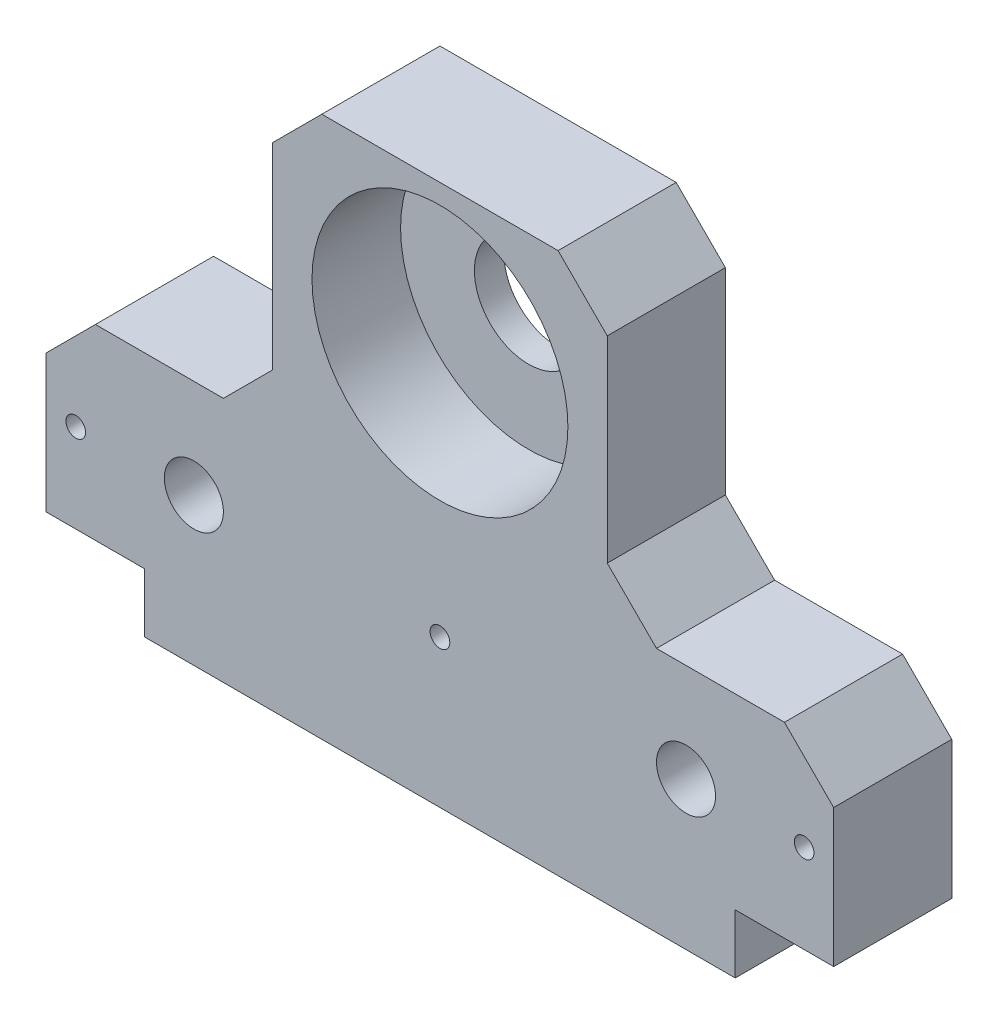
ISO-10303-21;
HEADER;
FILE_DESCRIPTION(('STEP AP214'),'2;1');
FILE_NAME('part.step','',(''),(''),'','','');
FILE_SCHEMA(('AUTOMOTIVE_DESIGN { 1 0 10303 214 1 1 1 1 }'));
ENDSEC;
DATA;
#1=APPLICATION_CONTEXT('core data for automotive mechanical design processes');
#2=APPLICATION_PROTOCOL_DEFINITION('international standard','automotive_design',2000,#1);
#3=PRODUCT_CONTEXT('',#1,'mechanical');
#4=PRODUCT('Part','Part','',(#3));
#5=PRODUCT_RELATED_PRODUCT_CATEGORY('part','',(#4));
#6=PRODUCT_DEFINITION_FORMATION('','',#4);
#7=PRODUCT_DEFINITION_CONTEXT('part definition',#1,'design');
#8=PRODUCT_DEFINITION('design','',#6,#7);
#9=PRODUCT_DEFINITION_SHAPE('','',#8);
#10=(LENGTH_UNIT() NAMED_UNIT(*) SI_UNIT(.MILLI.,.METRE.));
#11=(NAMED_UNIT(*) PLANE_ANGLE_UNIT() SI_UNIT($,.RADIAN.));
#12=(NAMED_UNIT(*) SI_UNIT($,.STERADIAN.) SOLID_ANGLE_UNIT());
#13=UNCERTAINTY_MEASURE_WITH_UNIT(LENGTH_MEASURE(1.E-05),#10,'distance_accuracy_value','');
#14=(GEOMETRIC_REPRESENTATION_CONTEXT(3) GLOBAL_UNCERTAINTY_ASSIGNED_CONTEXT((#13)) GLOBAL_UNIT_ASSIGNED_CONTEXT((#10,
#11,#12)) REPRESENTATION_CONTEXT('',''));
#15=CARTESIAN_POINT('',(0.,0.,0.));
#16=DIRECTION('',(0.,0.,1.));
#17=DIRECTION('',(1.,0.,0.));
#18=AXIS2_PLACEMENT_3D('',#15,#16,#17);
#19=CARTESIAN_POINT('',(0.,0.,12.));
#20=DIRECTION('',(0.,0.,1.));
#21=DIRECTION('',(1.,0.,0.));
#22=AXIS2_PLACEMENT_3D('',#19,#20,#21);
#23=PLANE('',#22);
#24=CARTESIAN_POINT('',(0.,15.,12.));
#25=DIRECTION('',(0.,0.,-1.));
#26=DIRECTION('',(-1.,0.,0.));
#27=AXIS2_PLACEMENT_3D('',#24,#25,#26);
#28=CIRCLE('',#27,1.);
#29=CARTESIAN_POINT('',(-1.,15.,12.));
#30=VERTEX_POINT('',#29);
#31=EDGE_CURVE('E366',#30,#30,#28,.T.);
#32=ORIENTED_EDGE('',*,*,#31,.T.);
#33=EDGE_LOOP('',(#32));
#34=FACE_BOUND('',#33,.T.);
#35=CARTESIAN_POINT('',(-37.,15.,12.));
#36=DIRECTION('',(0.,0.,-1.));
#37=DIRECTION('',(1.,0.,0.));
#38=AXIS2_PLACEMENT_3D('',#35,#36,#37);
#39=CIRCLE('',#38,0.999999999999998);
#40=CARTESIAN_POINT('',(-36.,15.,12.));
#41=VERTEX_POINT('',#40);
#42=EDGE_CURVE('E361',#41,#41,#39,.T.);
#43=ORIENTED_EDGE('',*,*,#42,.T.);
#44=EDGE_LOOP('',(#43));
#45=FACE_BOUND('',#44,.T.);
#46=CARTESIAN_POINT('',(37.,15.,12.));
#47=DIRECTION('',(0.,0.,-1.));
#48=DIRECTION('',(-1.,0.,0.));
#49=AXIS2_PLACEMENT_3D('',#46,#47,#48);
#50=CIRCLE('',#49,0.999999999999998);
#51=CARTESIAN_POINT('',(36.,15.,12.));
#52=VERTEX_POINT('',#51);
#53=EDGE_CURVE('E353',#52,#52,#50,.T.);
#54=ORIENTED_EDGE('',*,*,#53,.T.);
#55=EDGE_LOOP('',(#54));
#56=FACE_BOUND('',#55,.T.);
#57=DIRECTION('',(0.,1.,0.));
#58=VECTOR('',#57,1.);
#59=CARTESIAN_POINT('',(17.,25.,12.));
#60=LINE('',#59,#58);
#61=CARTESIAN_POINT('',(17.,30.,12.));
#62=VERTEX_POINT('',#61);
#63=CARTESIAN_POINT('',(17.,50.,12.));
#64=VERTEX_POINT('',#63);
#65=EDGE_CURVE('E268',#62,#64,#60,.T.);
#66=ORIENTED_EDGE('',*,*,#65,.T.);
#67=DIRECTION('',(0.707106781186547,-0.707106781186549,0.));
#68=VECTOR('',#67,1.);
#69=CARTESIAN_POINT('',(33.5,33.4999999999999,12.));
#70=LINE('',#69,#68);
#71=CARTESIAN_POINT('',(12.,55.,12.));
#72=VERTEX_POINT('',#71);
#73=EDGE_CURVE('E317',#64,#72,#70,.F.);
#74=ORIENTED_EDGE('',*,*,#73,.T.);
#75=DIRECTION('',(-1.,0.,0.));
#76=VECTOR('',#75,1.);
#77=CARTESIAN_POINT('',(17.,55.,12.));
#78=LINE('',#77,#76);
#79=CARTESIAN_POINT('',(-12.,55.,12.));
#80=VERTEX_POINT('',#79);
#81=EDGE_CURVE('E271',#72,#80,#78,.T.);
#82=ORIENTED_EDGE('',*,*,#81,.T.);
#83=DIRECTION('',(0.707106781186548,0.707106781186548,0.));
#84=VECTOR('',#83,1.);
#85=CARTESIAN_POINT('',(-33.5,33.5,12.));
#86=LINE('',#85,#84);
#87=CARTESIAN_POINT('',(-17.,50.,12.));
#88=VERTEX_POINT('',#87);
#89=EDGE_CURVE('E315',#80,#88,#86,.F.);
#90=ORIENTED_EDGE('',*,*,#89,.T.);
#91=DIRECTION('',(0.,-1.,0.));
#92=VECTOR('',#91,1.);
#93=CARTESIAN_POINT('',(-17.,25.,12.));
#94=LINE('',#93,#92);
#95=CARTESIAN_POINT('',(-17.,30.,12.));
#96=VERTEX_POINT('',#95);
#97=EDGE_CURVE('E251',#88,#96,#94,.T.);
#98=ORIENTED_EDGE('',*,*,#97,.T.);
#99=DIRECTION('',(0.707106781186551,0.707106781186544,0.));
#100=VECTOR('',#99,1.);
#101=CARTESIAN_POINT('',(-22.,25.,12.));
#102=LINE('',#101,#100);
#103=CARTESIAN_POINT('',(-22.,25.,12.));
#104=VERTEX_POINT('',#103);
#105=EDGE_CURVE('E11',#96,#104,#102,.F.);
#106=ORIENTED_EDGE('',*,*,#105,.T.);
#107=DIRECTION('',(-1.,0.,0.));
#108=VECTOR('',#107,1.);
#109=CARTESIAN_POINT('',(-40.,25.,12.));
#110=LINE('',#109,#108);
#111=CARTESIAN_POINT('',(-35.,25.,12.));
#112=VERTEX_POINT('',#111);
#113=EDGE_CURVE('E254',#104,#112,#110,.T.);
#114=ORIENTED_EDGE('',*,*,#113,.T.);
#115=DIRECTION('',(0.707106781186549,0.707106781186546,0.));
#116=VECTOR('',#115,1.);
#117=CARTESIAN_POINT('',(-29.9999999999999,30.0000000000001,12.));
#118=LINE('',#117,#116);
#119=CARTESIAN_POINT('',(-40.,20.,12.));
#120=VERTEX_POINT('',#119);
#121=EDGE_CURVE('E50',#112,#120,#118,.F.);
#122=ORIENTED_EDGE('',*,*,#121,.T.);
#123=DIRECTION('',(0.,-1.,0.));
#124=VECTOR('',#123,1.);
#125=CARTESIAN_POINT('',(-40.,0.,12.));
#126=LINE('',#125,#124);
#127=CARTESIAN_POINT('',(-40.,6.,12.));
#128=VERTEX_POINT('',#127);
#129=EDGE_CURVE('E257',#120,#128,#126,.T.);
#130=ORIENTED_EDGE('',*,*,#129,.T.);
#131=DIRECTION('',(-1.,0.,0.));
#132=VECTOR('',#131,1.);
#133=CARTESIAN_POINT('',(-40.,6.,12.));
#134=LINE('',#133,#132);
#135=CARTESIAN_POINT('',(-30.,6.,12.));
#136=VERTEX_POINT('',#135);
#137=EDGE_CURVE('E203',#136,#128,#134,.T.);
#138=ORIENTED_EDGE('',*,*,#137,.F.);
#139=DIRECTION('',(0.,1.,0.));
#140=VECTOR('',#139,1.);
#141=CARTESIAN_POINT('',(-30.,0.,12.));
#142=LINE('',#141,#140);
#143=CARTESIAN_POINT('',(-30.,0.,12.));
#144=VERTEX_POINT('',#143);
#145=EDGE_CURVE('E196',#144,#136,#142,.T.);
#146=ORIENTED_EDGE('',*,*,#145,.F.);
#147=DIRECTION('',(1.,0.,0.));
#148=VECTOR('',#147,1.);
#149=CARTESIAN_POINT('',(-40.,0.,12.));
#150=LINE('',#149,#148);
#151=CARTESIAN_POINT('',(30.,0.,12.));
#152=VERTEX_POINT('',#151);
#153=EDGE_CURVE('E259',#144,#152,#150,.T.);
#154=ORIENTED_EDGE('',*,*,#153,.T.);
#155=DIRECTION('',(0.,-1.,0.));
#156=VECTOR('',#155,1.);
#157=CARTESIAN_POINT('',(30.,0.,12.));
#158=LINE('',#157,#156);
#159=CARTESIAN_POINT('',(30.,6.,12.));
#160=VERTEX_POINT('',#159);
#161=EDGE_CURVE('E187',#160,#152,#158,.T.);
#162=ORIENTED_EDGE('',*,*,#161,.F.);
#163=DIRECTION('',(-1.,0.,0.));
#164=VECTOR('',#163,1.);
#165=CARTESIAN_POINT('',(40.,6.,12.));
#166=LINE('',#165,#164);
#167=CARTESIAN_POINT('',(40.,6.,12.));
#168=VERTEX_POINT('',#167);
#169=EDGE_CURVE('E167',#168,#160,#166,.T.);
#170=ORIENTED_EDGE('',*,*,#169,.F.);
#171=DIRECTION('',(0.,1.,0.));
#172=VECTOR('',#171,1.);
#173=CARTESIAN_POINT('',(40.,0.,12.));
#174=LINE('',#173,#172);
#175=CARTESIAN_POINT('',(40.,20.,12.));
#176=VERTEX_POINT('',#175);
#177=EDGE_CURVE('E262',#168,#176,#174,.T.);
#178=ORIENTED_EDGE('',*,*,#177,.T.);
#179=DIRECTION('',(0.707106781186546,-0.70710678118655,0.));
#180=VECTOR('',#179,1.);
#181=CARTESIAN_POINT('',(30.0000000000001,29.9999999999999,12.));
#182=LINE('',#181,#180);
#183=CARTESIAN_POINT('',(35.,25.,12.));
#184=VERTEX_POINT('',#183);
#185=EDGE_CURVE('E313',#176,#184,#182,.F.);
#186=ORIENTED_EDGE('',*,*,#185,.T.);
#187=DIRECTION('',(-1.,0.,0.));
#188=VECTOR('',#187,1.);
#189=CARTESIAN_POINT('',(40.,25.,12.));
#190=LINE('',#189,#188);
#191=CARTESIAN_POINT('',(22.,25.,12.));
#192=VERTEX_POINT('',#191);
#193=EDGE_CURVE('E265',#184,#192,#190,.T.);
#194=ORIENTED_EDGE('',*,*,#193,.T.);
#195=DIRECTION('',(0.707106781186544,-0.707106781186551,0.));
#196=VECTOR('',#195,1.);
#197=CARTESIAN_POINT('',(17.,30.,12.));
#198=LINE('',#197,#196);
#199=EDGE_CURVE('E340',#192,#62,#198,.F.);
#200=ORIENTED_EDGE('',*,*,#199,.T.);
#201=EDGE_LOOP('',(#66,#74,#82,#90,#98,#106,#114,#122,#130,#138,#146,#154,#162,#170,#178,#186,
#194,#200));
#202=FACE_BOUND('',#201,.T.);
#203=CARTESIAN_POINT('',(-25.,15.,12.));
#204=DIRECTION('',(0.,0.,-1.));
#205=DIRECTION('',(1.,0.,0.));
#206=AXIS2_PLACEMENT_3D('',#203,#204,#205);
#207=CIRCLE('',#206,3.);
#208=CARTESIAN_POINT('',(-22.,15.,12.));
#209=VERTEX_POINT('',#208);
#210=EDGE_CURVE('E218',#209,#209,#207,.T.);
#211=ORIENTED_EDGE('',*,*,#210,.T.);
#212=EDGE_LOOP('',(#211));
#213=FACE_BOUND('',#212,.T.);
#214=CARTESIAN_POINT('',(25.,15.,12.));
#215=DIRECTION('',(0.,0.,-1.));
#216=DIRECTION('',(-1.,0.,0.));
#217=AXIS2_PLACEMENT_3D('',#214,#215,#216);
#218=CIRCLE('',#217,3.);
#219=CARTESIAN_POINT('',(22.,15.,12.));
#220=VERTEX_POINT('',#219);
#221=EDGE_CURVE('E224',#220,#220,#218,.T.);
#222=ORIENTED_EDGE('',*,*,#221,.T.);
#223=EDGE_LOOP('',(#222));
#224=FACE_BOUND('',#223,.T.);
#225=CARTESIAN_POINT('',(0.,40.,12.));
#226=DIRECTION('',(0.,0.,1.));
#227=DIRECTION('',(1.,0.,0.));
#228=AXIS2_PLACEMENT_3D('',#225,#226,#227);
#229=CIRCLE('',#228,13.);
#230=CARTESIAN_POINT('',(13.,40.,12.));
#231=VERTEX_POINT('',#230);
#232=EDGE_CURVE('E245',#231,#231,#229,.T.);
#233=ORIENTED_EDGE('',*,*,#232,.F.);
#234=EDGE_LOOP('',(#233));
#235=FACE_BOUND('',#234,.T.);
#236=ADVANCED_FACE('F33',(#34,#45,#56,#202,#213,#224,#235),#23,.T.);
#237=CARTESIAN_POINT('',(0.,0.,0.));
#238=DIRECTION('',(0.,0.,1.));
#239=DIRECTION('',(1.,0.,0.));
#240=AXIS2_PLACEMENT_3D('',#237,#238,#239);
#241=PLANE('',#240);
#242=CARTESIAN_POINT('',(0.,15.,0.));
#243=DIRECTION('',(0.,0.,-1.));
#244=DIRECTION('',(-1.,0.,0.));
#245=AXIS2_PLACEMENT_3D('',#242,#243,#244);
#246=CIRCLE('',#245,1.);
#247=CARTESIAN_POINT('',(-1.,15.,0.));
#248=VERTEX_POINT('',#247);
#249=EDGE_CURVE('E369',#248,#248,#246,.T.);
#250=ORIENTED_EDGE('',*,*,#249,.F.);
#251=EDGE_LOOP('',(#250));
#252=FACE_BOUND('',#251,.T.);
#253=CARTESIAN_POINT('',(-37.,15.,0.));
#254=DIRECTION('',(0.,0.,-1.));
#255=DIRECTION('',(1.,0.,0.));
#256=AXIS2_PLACEMENT_3D('',#253,#254,#255);
#257=CIRCLE('',#256,0.999999999999998);
#258=CARTESIAN_POINT('',(-36.,15.,0.));
#259=VERTEX_POINT('',#258);
#260=EDGE_CURVE('E363',#259,#259,#257,.T.);
#261=ORIENTED_EDGE('',*,*,#260,.F.);
#262=EDGE_LOOP('',(#261));
#263=FACE_BOUND('',#262,.T.);
#264=CARTESIAN_POINT('',(37.,15.,0.));
#265=DIRECTION('',(0.,0.,-1.));
#266=DIRECTION('',(-1.,0.,0.));
#267=AXIS2_PLACEMENT_3D('',#264,#265,#266);
#268=CIRCLE('',#267,0.999999999999998);
#269=CARTESIAN_POINT('',(36.,15.,0.));
#270=VERTEX_POINT('',#269);
#271=EDGE_CURVE('E357',#270,#270,#268,.T.);
#272=ORIENTED_EDGE('',*,*,#271,.F.);
#273=EDGE_LOOP('',(#272));
#274=FACE_BOUND('',#273,.T.);
#275=CARTESIAN_POINT('',(-9.99999999999999,45.,0.));
#276=DIRECTION('',(0.,0.,-1.));
#277=DIRECTION('',(1.,0.,0.));
#278=AXIS2_PLACEMENT_3D('',#275,#276,#277);
#279=CIRCLE('',#278,1.);
#280=CARTESIAN_POINT('',(-8.99999999999999,45.,0.));
#281=VERTEX_POINT('',#280);
#282=EDGE_CURVE('E349',#281,#281,#279,.T.);
#283=ORIENTED_EDGE('',*,*,#282,.F.);
#284=EDGE_LOOP('',(#283));
#285=FACE_BOUND('',#284,.T.);
#286=CARTESIAN_POINT('',(10.,45.,0.));
#287=DIRECTION('',(0.,0.,-1.));
#288=DIRECTION('',(-1.,0.,0.));
#289=AXIS2_PLACEMENT_3D('',#286,#287,#288);
#290=CIRCLE('',#289,1.);
#291=CARTESIAN_POINT('',(9.,45.,0.));
#292=VERTEX_POINT('',#291);
#293=EDGE_CURVE('E191',#292,#292,#290,.T.);
#294=ORIENTED_EDGE('',*,*,#293,.F.);
#295=EDGE_LOOP('',(#294));
#296=FACE_BOUND('',#295,.T.);
#297=CARTESIAN_POINT('',(-25.,15.,0.));
#298=DIRECTION('',(0.,0.,-1.));
#299=DIRECTION('',(1.,0.,0.));
#300=AXIS2_PLACEMENT_3D('',#297,#298,#299);
#301=CIRCLE('',#300,8.);
#302=CARTESIAN_POINT('',(-17.,15.,0.));
#303=VERTEX_POINT('',#302);
#304=EDGE_CURVE('E227',#303,#303,#301,.T.);
#305=ORIENTED_EDGE('',*,*,#304,.F.);
#306=EDGE_LOOP('',(#305));
#307=FACE_BOUND('',#306,.T.);
#308=CARTESIAN_POINT('',(25.,15.,0.));
#309=DIRECTION('',(0.,0.,-1.));
#310=DIRECTION('',(-1.,0.,0.));
#311=AXIS2_PLACEMENT_3D('',#308,#309,#310);
#312=CIRCLE('',#311,8.);
#313=CARTESIAN_POINT('',(17.,15.,0.));
#314=VERTEX_POINT('',#313);
#315=EDGE_CURVE('E233',#314,#314,#312,.T.);
#316=ORIENTED_EDGE('',*,*,#315,.F.);
#317=EDGE_LOOP('',(#316));
#318=FACE_BOUND('',#317,.T.);
#319=DIRECTION('',(-1.,0.,0.));
#320=VECTOR('',#319,1.);
#321=CARTESIAN_POINT('',(17.,55.,0.));
#322=LINE('',#321,#320);
#323=CARTESIAN_POINT('',(12.,55.,0.));
#324=VERTEX_POINT('',#323);
#325=CARTESIAN_POINT('',(-12.,55.,0.));
#326=VERTEX_POINT('',#325);
#327=EDGE_CURVE('E255',#324,#326,#322,.T.);
#328=ORIENTED_EDGE('',*,*,#327,.F.);
#329=DIRECTION('',(-0.707106781186547,0.707106781186549,0.));
#330=VECTOR('',#329,1.);
#331=CARTESIAN_POINT('',(12.,55.,0.));
#332=LINE('',#331,#330);
#333=CARTESIAN_POINT('',(17.,50.,0.));
#334=VERTEX_POINT('',#333);
#335=EDGE_CURVE('E305',#324,#334,#332,.F.);
#336=ORIENTED_EDGE('',*,*,#335,.T.);
#337=DIRECTION('',(0.,1.,0.));
#338=VECTOR('',#337,1.);
#339=CARTESIAN_POINT('',(17.,25.,0.));
#340=LINE('',#339,#338);
#341=CARTESIAN_POINT('',(17.,30.,0.));
#342=VERTEX_POINT('',#341);
#343=EDGE_CURVE('E287',#342,#334,#340,.T.);
#344=ORIENTED_EDGE('',*,*,#343,.F.);
#345=DIRECTION('',(-0.707106781186544,0.707106781186551,0.));
#346=VECTOR('',#345,1.);
#347=CARTESIAN_POINT('',(23.5000000000001,23.4999999999998,0.));
#348=LINE('',#347,#346);
#349=CARTESIAN_POINT('',(22.,25.,0.));
#350=VERTEX_POINT('',#349);
#351=EDGE_CURVE('E338',#342,#350,#348,.F.);
#352=ORIENTED_EDGE('',*,*,#351,.T.);
#353=DIRECTION('',(-1.,0.,0.));
#354=VECTOR('',#353,1.);
#355=CARTESIAN_POINT('',(40.,25.,0.));
#356=LINE('',#355,#354);
#357=CARTESIAN_POINT('',(35.,25.,0.));
#358=VERTEX_POINT('',#357);
#359=EDGE_CURVE('E284',#358,#350,#356,.T.);
#360=ORIENTED_EDGE('',*,*,#359,.F.);
#361=DIRECTION('',(-0.707106781186546,0.70710678118655,0.));
#362=VECTOR('',#361,1.);
#363=CARTESIAN_POINT('',(35.,25.,0.));
#364=LINE('',#363,#362);
#365=CARTESIAN_POINT('',(40.,20.,0.));
#366=VERTEX_POINT('',#365);
#367=EDGE_CURVE('E301',#358,#366,#364,.F.);
#368=ORIENTED_EDGE('',*,*,#367,.T.);
#369=DIRECTION('',(0.,1.,0.));
#370=VECTOR('',#369,1.);
#371=CARTESIAN_POINT('',(40.,0.,0.));
#372=LINE('',#371,#370);
#373=CARTESIAN_POINT('',(40.,6.,0.));
#374=VERTEX_POINT('',#373);
#375=EDGE_CURVE('E186',#374,#366,#372,.T.);
#376=ORIENTED_EDGE('',*,*,#375,.F.);
#377=DIRECTION('',(-1.,0.,0.));
#378=VECTOR('',#377,1.);
#379=CARTESIAN_POINT('',(40.,6.,0.));
#380=LINE('',#379,#378);
#381=CARTESIAN_POINT('',(30.,6.,0.));
#382=VERTEX_POINT('',#381);
#383=EDGE_CURVE('E164',#374,#382,#380,.T.);
#384=ORIENTED_EDGE('',*,*,#383,.T.);
#385=DIRECTION('',(0.,-1.,0.));
#386=VECTOR('',#385,1.);
#387=CARTESIAN_POINT('',(30.,0.,0.));
#388=LINE('',#387,#386);
#389=CARTESIAN_POINT('',(30.,0.,0.));
#390=VERTEX_POINT('',#389);
#391=EDGE_CURVE('E174',#382,#390,#388,.T.);
#392=ORIENTED_EDGE('',*,*,#391,.T.);
#393=DIRECTION('',(1.,0.,0.));
#394=VECTOR('',#393,1.);
#395=CARTESIAN_POINT('',(-40.,0.,0.));
#396=LINE('',#395,#394);
#397=CARTESIAN_POINT('',(-30.,0.,0.));
#398=VERTEX_POINT('',#397);
#399=EDGE_CURVE('E281',#398,#390,#396,.T.);
#400=ORIENTED_EDGE('',*,*,#399,.F.);
#401=DIRECTION('',(0.,1.,0.));
#402=VECTOR('',#401,1.);
#403=CARTESIAN_POINT('',(-30.,0.,0.));
#404=LINE('',#403,#402);
#405=CARTESIAN_POINT('',(-30.,6.,0.));
#406=VERTEX_POINT('',#405);
#407=EDGE_CURVE('E199',#398,#406,#404,.T.);
#408=ORIENTED_EDGE('',*,*,#407,.T.);
#409=DIRECTION('',(-1.,0.,0.));
#410=VECTOR('',#409,1.);
#411=CARTESIAN_POINT('',(-40.,6.,0.));
#412=LINE('',#411,#410);
#413=CARTESIAN_POINT('',(-40.,6.,0.));
#414=VERTEX_POINT('',#413);
#415=EDGE_CURVE('E202',#406,#414,#412,.T.);
#416=ORIENTED_EDGE('',*,*,#415,.T.);
#417=DIRECTION('',(0.,-1.,0.));
#418=VECTOR('',#417,1.);
#419=CARTESIAN_POINT('',(-40.,0.,0.));
#420=LINE('',#419,#418);
#421=CARTESIAN_POINT('',(-40.,20.,0.));
#422=VERTEX_POINT('',#421);
#423=EDGE_CURVE('E279',#422,#414,#420,.T.);
#424=ORIENTED_EDGE('',*,*,#423,.F.);
#425=DIRECTION('',(-0.707106781186549,-0.707106781186546,0.));
#426=VECTOR('',#425,1.);
#427=CARTESIAN_POINT('',(-40.,20.,0.));
#428=LINE('',#427,#426);
#429=CARTESIAN_POINT('',(-35.,25.,0.));
#430=VERTEX_POINT('',#429);
#431=EDGE_CURVE('E299',#422,#430,#428,.F.);
#432=ORIENTED_EDGE('',*,*,#431,.T.);
#433=DIRECTION('',(-1.,0.,0.));
#434=VECTOR('',#433,1.);
#435=CARTESIAN_POINT('',(-40.,25.,0.));
#436=LINE('',#435,#434);
#437=CARTESIAN_POINT('',(-22.,25.,0.));
#438=VERTEX_POINT('',#437);
#439=EDGE_CURVE('E277',#438,#430,#436,.T.);
#440=ORIENTED_EDGE('',*,*,#439,.F.);
#441=DIRECTION('',(-0.707106781186551,-0.707106781186544,0.));
#442=VECTOR('',#441,1.);
#443=CARTESIAN_POINT('',(-23.4999999999999,23.5000000000001,0.));
#444=LINE('',#443,#442);
#445=CARTESIAN_POINT('',(-17.,30.,0.));
#446=VERTEX_POINT('',#445);
#447=EDGE_CURVE('E42',#438,#446,#444,.F.);
#448=ORIENTED_EDGE('',*,*,#447,.T.);
#449=DIRECTION('',(0.,-1.,0.));
#450=VECTOR('',#449,1.);
#451=CARTESIAN_POINT('',(-17.,25.,0.));
#452=LINE('',#451,#450);
#453=CARTESIAN_POINT('',(-17.,50.,0.));
#454=VERTEX_POINT('',#453);
#455=EDGE_CURVE('E250',#454,#446,#452,.T.);
#456=ORIENTED_EDGE('',*,*,#455,.F.);
#457=DIRECTION('',(-0.707106781186548,-0.707106781186548,0.));
#458=VECTOR('',#457,1.);
#459=CARTESIAN_POINT('',(-17.,50.,0.));
#460=LINE('',#459,#458);
#461=EDGE_CURVE('E303',#454,#326,#460,.F.);
#462=ORIENTED_EDGE('',*,*,#461,.T.);
#463=EDGE_LOOP('',(#328,#336,#344,#352,#360,#368,#376,#384,#392,#400,#408,#416,#424,#432,#440,
#448,#456,#462));
#464=FACE_BOUND('',#463,.T.);
#465=CARTESIAN_POINT('',(0.,40.,0.));
#466=DIRECTION('',(0.,0.,1.));
#467=DIRECTION('',(1.,0.,0.));
#468=AXIS2_PLACEMENT_3D('',#465,#466,#467);
#469=CIRCLE('',#468,5.5);
#470=CARTESIAN_POINT('',(5.5,40.,0.));
#471=VERTEX_POINT('',#470);
#472=EDGE_CURVE('E239',#471,#471,#469,.T.);
#473=ORIENTED_EDGE('',*,*,#472,.T.);
#474=EDGE_LOOP('',(#473));
#475=FACE_BOUND('',#474,.T.);
#476=ADVANCED_FACE('F183',(#252,#263,#274,#285,#296,#307,#318,#464,#475),#241,.F.);
#477=CARTESIAN_POINT('',(-17.,25.,12.));
#478=DIRECTION('',(1.,0.,0.));
#479=DIRECTION('',(0.,1.,0.));
#480=AXIS2_PLACEMENT_3D('',#477,#478,#479);
#481=PLANE('',#480);
#482=ORIENTED_EDGE('',*,*,#97,.F.);
#483=DIRECTION('',(0.,0.,-1.));
#484=VECTOR('',#483,1.);
#485=CARTESIAN_POINT('',(-17.,50.,12.));
#486=LINE('',#485,#484);
#487=EDGE_CURVE('E321',#88,#454,#486,.T.);
#488=ORIENTED_EDGE('',*,*,#487,.T.);
#489=ORIENTED_EDGE('',*,*,#455,.T.);
#490=DIRECTION('',(0.,0.,1.));
#491=VECTOR('',#490,1.);
#492=CARTESIAN_POINT('',(-17.,30.,12.));
#493=LINE('',#492,#491);
#494=EDGE_CURVE('E319',#446,#96,#493,.T.);
#495=ORIENTED_EDGE('',*,*,#494,.T.);
#496=EDGE_LOOP('',(#482,#488,#489,#495));
#497=FACE_BOUND('',#496,.T.);
#498=ADVANCED_FACE('F386',(#497),#481,.F.);
#499=CARTESIAN_POINT('',(-40.,25.,12.));
#500=DIRECTION('',(0.,-1.,0.));
#501=DIRECTION('',(1.,0.,0.));
#502=AXIS2_PLACEMENT_3D('',#499,#500,#501);
#503=PLANE('',#502);
#504=ORIENTED_EDGE('',*,*,#113,.F.);
#505=DIRECTION('',(0.,0.,-1.));
#506=VECTOR('',#505,1.);
#507=CARTESIAN_POINT('',(-22.,25.,0.));
#508=LINE('',#507,#506);
#509=EDGE_CURVE('E332',#104,#438,#508,.T.);
#510=ORIENTED_EDGE('',*,*,#509,.T.);
#511=ORIENTED_EDGE('',*,*,#439,.T.);
#512=DIRECTION('',(0.,0.,1.));
#513=VECTOR('',#512,1.);
#514=CARTESIAN_POINT('',(-35.,25.,12.));
#515=LINE('',#514,#513);
#516=EDGE_CURVE('E58',#430,#112,#515,.T.);
#517=ORIENTED_EDGE('',*,*,#516,.T.);
#518=EDGE_LOOP('',(#504,#510,#511,#517));
#519=FACE_BOUND('',#518,.T.);
#520=ADVANCED_FACE('F446',(#519),#503,.F.);
#521=CARTESIAN_POINT('',(-40.,0.,12.));
#522=DIRECTION('',(1.,0.,0.));
#523=DIRECTION('',(0.,0.,-1.));
#524=AXIS2_PLACEMENT_3D('',#521,#522,#523);
#525=PLANE('',#524);
#526=ORIENTED_EDGE('',*,*,#129,.F.);
#527=DIRECTION('',(0.,0.,-1.));
#528=VECTOR('',#527,1.);
#529=CARTESIAN_POINT('',(-40.,20.,12.));
#530=LINE('',#529,#528);
#531=EDGE_CURVE('E335',#120,#422,#530,.T.);
#532=ORIENTED_EDGE('',*,*,#531,.T.);
#533=ORIENTED_EDGE('',*,*,#423,.T.);
#534=DIRECTION('',(0.,0.,1.));
#535=VECTOR('',#534,1.);
#536=CARTESIAN_POINT('',(-40.,6.,0.));
#537=LINE('',#536,#535);
#538=EDGE_CURVE('E211',#414,#128,#537,.T.);
#539=ORIENTED_EDGE('',*,*,#538,.T.);
#540=EDGE_LOOP('',(#526,#532,#533,#539));
#541=FACE_BOUND('',#540,.T.);
#542=ADVANCED_FACE('F442',(#541),#525,.F.);
#543=CARTESIAN_POINT('',(-40.,0.,12.));
#544=DIRECTION('',(0.,1.,0.));
#545=DIRECTION('',(0.,0.,1.));
#546=AXIS2_PLACEMENT_3D('',#543,#544,#545);
#547=PLANE('',#546);
#548=ORIENTED_EDGE('',*,*,#399,.T.);
#549=DIRECTION('',(0.,0.,1.));
#550=VECTOR('',#549,1.);
#551=CARTESIAN_POINT('',(30.,0.,0.));
#552=LINE('',#551,#550);
#553=EDGE_CURVE('E170',#390,#152,#552,.T.);
#554=ORIENTED_EDGE('',*,*,#553,.T.);
#555=ORIENTED_EDGE('',*,*,#153,.F.);
#556=DIRECTION('',(0.,0.,1.));
#557=VECTOR('',#556,1.);
#558=CARTESIAN_POINT('',(-30.,0.,0.));
#559=LINE('',#558,#557);
#560=EDGE_CURVE('E206',#398,#144,#559,.T.);
#561=ORIENTED_EDGE('',*,*,#560,.F.);
#562=EDGE_LOOP('',(#548,#554,#555,#561));
#563=FACE_BOUND('',#562,.T.);
#564=ADVANCED_FACE('F438',(#563),#547,.F.);
#565=CARTESIAN_POINT('',(40.,0.,12.));
#566=DIRECTION('',(-1.,0.,0.));
#567=DIRECTION('',(0.,0.,1.));
#568=AXIS2_PLACEMENT_3D('',#565,#566,#567);
#569=PLANE('',#568);
#570=ORIENTED_EDGE('',*,*,#375,.T.);
#571=DIRECTION('',(0.,0.,1.));
#572=VECTOR('',#571,1.);
#573=CARTESIAN_POINT('',(40.,20.,12.));
#574=LINE('',#573,#572);
#575=EDGE_CURVE('E329',#366,#176,#574,.T.);
#576=ORIENTED_EDGE('',*,*,#575,.T.);
#577=ORIENTED_EDGE('',*,*,#177,.F.);
#578=DIRECTION('',(0.,0.,1.));
#579=VECTOR('',#578,1.);
#580=CARTESIAN_POINT('',(40.,6.,0.));
#581=LINE('',#580,#579);
#582=EDGE_CURVE('E171',#374,#168,#581,.T.);
#583=ORIENTED_EDGE('',*,*,#582,.F.);
#584=EDGE_LOOP('',(#570,#576,#577,#583));
#585=FACE_BOUND('',#584,.T.);
#586=ADVANCED_FACE('F434',(#585),#569,.F.);
#587=CARTESIAN_POINT('',(40.,25.,12.));
#588=DIRECTION('',(0.,-1.,0.));
#589=DIRECTION('',(1.,0.,0.));
#590=AXIS2_PLACEMENT_3D('',#587,#588,#589);
#591=PLANE('',#590);
#592=ORIENTED_EDGE('',*,*,#193,.F.);
#593=DIRECTION('',(0.,0.,-1.));
#594=VECTOR('',#593,1.);
#595=CARTESIAN_POINT('',(35.,25.,12.));
#596=LINE('',#595,#594);
#597=EDGE_CURVE('E326',#184,#358,#596,.T.);
#598=ORIENTED_EDGE('',*,*,#597,.T.);
#599=ORIENTED_EDGE('',*,*,#359,.T.);
#600=DIRECTION('',(0.,0.,1.));
#601=VECTOR('',#600,1.);
#602=CARTESIAN_POINT('',(22.,25.,12.));
#603=LINE('',#602,#601);
#604=EDGE_CURVE('E324',#350,#192,#603,.T.);
#605=ORIENTED_EDGE('',*,*,#604,.T.);
#606=EDGE_LOOP('',(#592,#598,#599,#605));
#607=FACE_BOUND('',#606,.T.);
#608=ADVANCED_FACE('F430',(#607),#591,.F.);
#609=CARTESIAN_POINT('',(17.,25.,12.));
#610=DIRECTION('',(-1.,0.,0.));
#611=DIRECTION('',(0.,-1.,0.));
#612=AXIS2_PLACEMENT_3D('',#609,#610,#611);
#613=PLANE('',#612);
#614=ORIENTED_EDGE('',*,*,#343,.T.);
#615=DIRECTION('',(0.,0.,1.));
#616=VECTOR('',#615,1.);
#617=CARTESIAN_POINT('',(17.,50.,12.));
#618=LINE('',#617,#616);
#619=EDGE_CURVE('E310',#334,#64,#618,.T.);
#620=ORIENTED_EDGE('',*,*,#619,.T.);
#621=ORIENTED_EDGE('',*,*,#65,.F.);
#622=DIRECTION('',(0.,0.,-1.));
#623=VECTOR('',#622,1.);
#624=CARTESIAN_POINT('',(17.,30.,0.));
#625=LINE('',#624,#623);
#626=EDGE_CURVE('E307',#62,#342,#625,.T.);
#627=ORIENTED_EDGE('',*,*,#626,.T.);
#628=EDGE_LOOP('',(#614,#620,#621,#627));
#629=FACE_BOUND('',#628,.T.);
#630=ADVANCED_FACE('F426',(#629),#613,.F.);
#631=CARTESIAN_POINT('',(17.,55.,12.));
#632=DIRECTION('',(0.,-1.,0.));
#633=DIRECTION('',(1.,0.,0.));
#634=AXIS2_PLACEMENT_3D('',#631,#632,#633);
#635=PLANE('',#634);
#636=ORIENTED_EDGE('',*,*,#81,.F.);
#637=DIRECTION('',(0.,0.,-1.));
#638=VECTOR('',#637,1.);
#639=CARTESIAN_POINT('',(12.,55.,12.));
#640=LINE('',#639,#638);
#641=EDGE_CURVE('E296',#72,#324,#640,.T.);
#642=ORIENTED_EDGE('',*,*,#641,.T.);
#643=ORIENTED_EDGE('',*,*,#327,.T.);
#644=DIRECTION('',(0.,0.,1.));
#645=VECTOR('',#644,1.);
#646=CARTESIAN_POINT('',(-12.,55.,12.));
#647=LINE('',#646,#645);
#648=EDGE_CURVE('E294',#326,#80,#647,.T.);
#649=ORIENTED_EDGE('',*,*,#648,.T.);
#650=EDGE_LOOP('',(#636,#642,#643,#649));
#651=FACE_BOUND('',#650,.T.);
#652=ADVANCED_FACE('F423',(#651),#635,.F.);
#653=CARTESIAN_POINT('',(0.,40.,12.));
#654=DIRECTION('',(0.,0.,-1.));
#655=DIRECTION('',(-1.,0.,0.));
#656=AXIS2_PLACEMENT_3D('',#653,#654,#655);
#657=CYLINDRICAL_SURFACE('',#656,13.);
#658=CARTESIAN_POINT('',(0.,40.,3.));
#659=DIRECTION('',(0.,0.,1.));
#660=DIRECTION('',(1.,0.,0.));
#661=AXIS2_PLACEMENT_3D('',#658,#659,#660);
#662=CIRCLE('',#661,13.);
#663=CARTESIAN_POINT('',(13.,40.,3.));
#664=VERTEX_POINT('',#663);
#665=EDGE_CURVE('E274',#664,#664,#662,.T.);
#666=ORIENTED_EDGE('',*,*,#665,.F.);
#667=EDGE_LOOP('',(#666));
#668=FACE_BOUND('',#667,.T.);
#669=ORIENTED_EDGE('',*,*,#232,.T.);
#670=EDGE_LOOP('',(#669));
#671=FACE_BOUND('',#670,.T.);
#672=ADVANCED_FACE('F420',(#668,#671),#657,.F.);
#673=CARTESIAN_POINT('',(0.,40.,3.));
#674=DIRECTION('',(0.,0.,1.));
#675=DIRECTION('',(1.,0.,0.));
#676=AXIS2_PLACEMENT_3D('',#673,#674,#675);
#677=PLANE('',#676);
#678=CARTESIAN_POINT('',(-9.99999999999999,45.,3.));
#679=DIRECTION('',(0.,0.,1.));
#680=DIRECTION('',(1.,0.,0.));
#681=AXIS2_PLACEMENT_3D('',#678,#679,#680);
#682=CIRCLE('',#681,1.);
#683=CARTESIAN_POINT('',(-8.99999999999999,45.,3.));
#684=VERTEX_POINT('',#683);
#685=EDGE_CURVE('E37',#684,#684,#682,.T.);
#686=ORIENTED_EDGE('',*,*,#685,.F.);
#687=EDGE_LOOP('',(#686));
#688=FACE_BOUND('',#687,.T.);
#689=CARTESIAN_POINT('',(10.,45.,3.));
#690=DIRECTION('',(0.,0.,1.));
#691=DIRECTION('',(1.,0.,0.));
#692=AXIS2_PLACEMENT_3D('',#689,#690,#691);
#693=CIRCLE('',#692,1.);
#694=CARTESIAN_POINT('',(11.,45.,3.));
#695=VERTEX_POINT('',#694);
#696=EDGE_CURVE('E194',#695,#695,#693,.T.);
#697=ORIENTED_EDGE('',*,*,#696,.F.);
#698=EDGE_LOOP('',(#697));
#699=FACE_BOUND('',#698,.T.);
#700=ORIENTED_EDGE('',*,*,#665,.T.);
#701=EDGE_LOOP('',(#700));
#702=FACE_BOUND('',#701,.T.);
#703=CARTESIAN_POINT('',(0.,40.,3.));
#704=DIRECTION('',(0.,0.,1.));
#705=DIRECTION('',(1.,0.,0.));
#706=AXIS2_PLACEMENT_3D('',#703,#704,#705);
#707=CIRCLE('',#706,5.5);
#708=CARTESIAN_POINT('',(5.5,40.,3.));
#709=VERTEX_POINT('',#708);
#710=EDGE_CURVE('E242',#709,#709,#707,.T.);
#711=ORIENTED_EDGE('',*,*,#710,.F.);
#712=EDGE_LOOP('',(#711));
#713=FACE_BOUND('',#712,.T.);
#714=ADVANCED_FACE('F411',(#688,#699,#702,#713),#677,.T.);
#715=CARTESIAN_POINT('',(0.,40.,3.));
#716=DIRECTION('',(0.,0.,-1.));
#717=DIRECTION('',(-1.,0.,0.));
#718=AXIS2_PLACEMENT_3D('',#715,#716,#717);
#719=CYLINDRICAL_SURFACE('',#718,5.5);
#720=ORIENTED_EDGE('',*,*,#710,.T.);
#721=EDGE_LOOP('',(#720));
#722=FACE_BOUND('',#721,.T.);
#723=ORIENTED_EDGE('',*,*,#472,.F.);
#724=EDGE_LOOP('',(#723));
#725=FACE_BOUND('',#724,.T.);
#726=ADVANCED_FACE('F401',(#722,#725),#719,.F.);
#727=CARTESIAN_POINT('',(25.,15.,6.));
#728=DIRECTION('',(0.,0.,-1.));
#729=DIRECTION('',(-1.,0.,0.));
#730=AXIS2_PLACEMENT_3D('',#727,#728,#729);
#731=CYLINDRICAL_SURFACE('',#730,8.);
#732=CARTESIAN_POINT('',(25.,15.,6.));
#733=DIRECTION('',(0.,0.,-1.));
#734=DIRECTION('',(-1.,0.,0.));
#735=AXIS2_PLACEMENT_3D('',#732,#733,#734);
#736=CIRCLE('',#735,8.);
#737=CARTESIAN_POINT('',(17.,15.,6.));
#738=VERTEX_POINT('',#737);
#739=EDGE_CURVE('E236',#738,#738,#736,.T.);
#740=ORIENTED_EDGE('',*,*,#739,.F.);
#741=EDGE_LOOP('',(#740));
#742=FACE_BOUND('',#741,.T.);
#743=ORIENTED_EDGE('',*,*,#315,.T.);
#744=EDGE_LOOP('',(#743));
#745=FACE_BOUND('',#744,.T.);
#746=ADVANCED_FACE('F398',(#742,#745),#731,.F.);
#747=CARTESIAN_POINT('',(25.,15.,6.));
#748=DIRECTION('',(0.,0.,-1.));
#749=DIRECTION('',(-1.,0.,0.));
#750=AXIS2_PLACEMENT_3D('',#747,#748,#749);
#751=PLANE('',#750);
#752=CARTESIAN_POINT('',(25.,15.,6.));
#753=DIRECTION('',(0.,0.,-1.));
#754=DIRECTION('',(-1.,0.,0.));
#755=AXIS2_PLACEMENT_3D('',#752,#753,#754);
#756=CIRCLE('',#755,3.);
#757=CARTESIAN_POINT('',(22.,15.,6.));
#758=VERTEX_POINT('',#757);
#759=EDGE_CURVE('E221',#758,#758,#756,.T.);
#760=ORIENTED_EDGE('',*,*,#759,.F.);
#761=EDGE_LOOP('',(#760));
#762=FACE_BOUND('',#761,.T.);
#763=ORIENTED_EDGE('',*,*,#739,.T.);
#764=EDGE_LOOP('',(#763));
#765=FACE_BOUND('',#764,.T.);
#766=ADVANCED_FACE('F400',(#762,#765),#751,.T.);
#767=CARTESIAN_POINT('',(-25.,15.,6.));
#768=DIRECTION('',(0.,0.,-1.));
#769=DIRECTION('',(-1.,0.,0.));
#770=AXIS2_PLACEMENT_3D('',#767,#768,#769);
#771=CYLINDRICAL_SURFACE('',#770,8.);
#772=CARTESIAN_POINT('',(-25.,15.,6.));
#773=DIRECTION('',(0.,0.,-1.));
#774=DIRECTION('',(1.,0.,0.));
#775=AXIS2_PLACEMENT_3D('',#772,#773,#774);
#776=CIRCLE('',#775,8.);
#777=CARTESIAN_POINT('',(-17.,15.,6.));
#778=VERTEX_POINT('',#777);
#779=EDGE_CURVE('E230',#778,#778,#776,.T.);
#780=ORIENTED_EDGE('',*,*,#779,.F.);
#781=EDGE_LOOP('',(#780));
#782=FACE_BOUND('',#781,.T.);
#783=ORIENTED_EDGE('',*,*,#304,.T.);
#784=EDGE_LOOP('',(#783));
#785=FACE_BOUND('',#784,.T.);
#786=ADVANCED_FACE('F408',(#782,#785),#771,.F.);
#787=CARTESIAN_POINT('',(-25.,15.,6.));
#788=DIRECTION('',(0.,0.,1.));
#789=DIRECTION('',(1.,0.,0.));
#790=AXIS2_PLACEMENT_3D('',#787,#788,#789);
#791=PLANE('',#790);
#792=CARTESIAN_POINT('',(-25.,15.,6.));
#793=DIRECTION('',(0.,0.,-1.));
#794=DIRECTION('',(1.,0.,0.));
#795=AXIS2_PLACEMENT_3D('',#792,#793,#794);
#796=CIRCLE('',#795,3.);
#797=CARTESIAN_POINT('',(-22.,15.,6.));
#798=VERTEX_POINT('',#797);
#799=EDGE_CURVE('E214',#798,#798,#796,.T.);
#800=ORIENTED_EDGE('',*,*,#799,.F.);
#801=EDGE_LOOP('',(#800));
#802=FACE_BOUND('',#801,.T.);
#803=ORIENTED_EDGE('',*,*,#779,.T.);
#804=EDGE_LOOP('',(#803));
#805=FACE_BOUND('',#804,.T.);
#806=ADVANCED_FACE('F530',(#802,#805),#791,.F.);
#807=CARTESIAN_POINT('',(25.,15.,12.));
#808=DIRECTION('',(0.,0.,-1.));
#809=DIRECTION('',(-1.,0.,0.));
#810=AXIS2_PLACEMENT_3D('',#807,#808,#809);
#811=CYLINDRICAL_SURFACE('',#810,3.);
#812=ORIENTED_EDGE('',*,*,#221,.F.);
#813=EDGE_LOOP('',(#812));
#814=FACE_BOUND('',#813,.T.);
#815=ORIENTED_EDGE('',*,*,#759,.T.);
#816=EDGE_LOOP('',(#815));
#817=FACE_BOUND('',#816,.T.);
#818=ADVANCED_FACE('F526',(#814,#817),#811,.F.);
#819=CARTESIAN_POINT('',(-25.,15.,12.));
#820=DIRECTION('',(0.,0.,-1.));
#821=DIRECTION('',(-1.,0.,0.));
#822=AXIS2_PLACEMENT_3D('',#819,#820,#821);
#823=CYLINDRICAL_SURFACE('',#822,3.);
#824=ORIENTED_EDGE('',*,*,#210,.F.);
#825=EDGE_LOOP('',(#824));
#826=FACE_BOUND('',#825,.T.);
#827=ORIENTED_EDGE('',*,*,#799,.T.);
#828=EDGE_LOOP('',(#827));
#829=FACE_BOUND('',#828,.T.);
#830=ADVANCED_FACE('F520',(#826,#829),#823,.F.);
#831=CARTESIAN_POINT('',(-40.,6.,0.));
#832=DIRECTION('',(0.,1.,0.));
#833=DIRECTION('',(0.,0.,1.));
#834=AXIS2_PLACEMENT_3D('',#831,#832,#833);
#835=PLANE('',#834);
#836=ORIENTED_EDGE('',*,*,#137,.T.);
#837=ORIENTED_EDGE('',*,*,#538,.F.);
#838=ORIENTED_EDGE('',*,*,#415,.F.);
#839=DIRECTION('',(0.,0.,1.));
#840=VECTOR('',#839,1.);
#841=CARTESIAN_POINT('',(-30.,6.,0.));
#842=LINE('',#841,#840);
#843=EDGE_CURVE('E215',#406,#136,#842,.T.);
#844=ORIENTED_EDGE('',*,*,#843,.T.);
#845=EDGE_LOOP('',(#836,#837,#838,#844));
#846=FACE_BOUND('',#845,.T.);
#847=ADVANCED_FACE('F489',(#846),#835,.F.);
#848=CARTESIAN_POINT('',(-30.,0.,0.));
#849=DIRECTION('',(1.,0.,0.));
#850=DIRECTION('',(0.,0.,-1.));
#851=AXIS2_PLACEMENT_3D('',#848,#849,#850);
#852=PLANE('',#851);
#853=ORIENTED_EDGE('',*,*,#145,.T.);
#854=ORIENTED_EDGE('',*,*,#843,.F.);
#855=ORIENTED_EDGE('',*,*,#407,.F.);
#856=ORIENTED_EDGE('',*,*,#560,.T.);
#857=EDGE_LOOP('',(#853,#854,#855,#856));
#858=FACE_BOUND('',#857,.T.);
#859=ADVANCED_FACE('F492',(#858),#852,.F.);
#860=CARTESIAN_POINT('',(30.,0.,0.));
#861=DIRECTION('',(-1.,0.,0.));
#862=DIRECTION('',(0.,0.,1.));
#863=AXIS2_PLACEMENT_3D('',#860,#861,#862);
#864=PLANE('',#863);
#865=ORIENTED_EDGE('',*,*,#161,.T.);
#866=ORIENTED_EDGE('',*,*,#553,.F.);
#867=ORIENTED_EDGE('',*,*,#391,.F.);
#868=DIRECTION('',(0.,0.,1.));
#869=VECTOR('',#868,1.);
#870=CARTESIAN_POINT('',(30.,6.,0.));
#871=LINE('',#870,#869);
#872=EDGE_CURVE('E160',#382,#160,#871,.T.);
#873=ORIENTED_EDGE('',*,*,#872,.T.);
#874=EDGE_LOOP('',(#865,#866,#867,#873));
#875=FACE_BOUND('',#874,.T.);
#876=ADVANCED_FACE('F175',(#875),#864,.F.);
#877=CARTESIAN_POINT('',(40.,6.,0.));
#878=DIRECTION('',(0.,1.,0.));
#879=DIRECTION('',(0.,0.,1.));
#880=AXIS2_PLACEMENT_3D('',#877,#878,#879);
#881=PLANE('',#880);
#882=ORIENTED_EDGE('',*,*,#169,.T.);
#883=ORIENTED_EDGE('',*,*,#872,.F.);
#884=ORIENTED_EDGE('',*,*,#383,.F.);
#885=ORIENTED_EDGE('',*,*,#582,.T.);
#886=EDGE_LOOP('',(#882,#883,#884,#885));
#887=FACE_BOUND('',#886,.T.);
#888=ADVANCED_FACE('F162',(#887),#881,.F.);
#889=CARTESIAN_POINT('',(12.,55.,12.));
#890=DIRECTION('',(-0.707106781186549,-0.707106781186547,0.));
#891=DIRECTION('',(0.,0.,-1.));
#892=AXIS2_PLACEMENT_3D('',#889,#890,#891);
#893=PLANE('',#892);
#894=ORIENTED_EDGE('',*,*,#73,.F.);
#895=ORIENTED_EDGE('',*,*,#619,.F.);
#896=ORIENTED_EDGE('',*,*,#335,.F.);
#897=ORIENTED_EDGE('',*,*,#641,.F.);
#898=EDGE_LOOP('',(#894,#895,#896,#897));
#899=FACE_BOUND('',#898,.T.);
#900=ADVANCED_FACE('F453',(#899),#893,.F.);
#901=CARTESIAN_POINT('',(-17.,50.,12.));
#902=DIRECTION('',(0.707106781186547,-0.707106781186547,0.));
#903=DIRECTION('',(0.,0.,-1.));
#904=AXIS2_PLACEMENT_3D('',#901,#902,#903);
#905=PLANE('',#904);
#906=ORIENTED_EDGE('',*,*,#89,.F.);
#907=ORIENTED_EDGE('',*,*,#648,.F.);
#908=ORIENTED_EDGE('',*,*,#461,.F.);
#909=ORIENTED_EDGE('',*,*,#487,.F.);
#910=EDGE_LOOP('',(#906,#907,#908,#909));
#911=FACE_BOUND('',#910,.T.);
#912=ADVANCED_FACE('F456',(#911),#905,.F.);
#913=CARTESIAN_POINT('',(35.,25.,12.));
#914=DIRECTION('',(-0.707106781186549,-0.707106781186545,0.));
#915=DIRECTION('',(0.,0.,-1.));
#916=AXIS2_PLACEMENT_3D('',#913,#914,#915);
#917=PLANE('',#916);
#918=ORIENTED_EDGE('',*,*,#185,.F.);
#919=ORIENTED_EDGE('',*,*,#575,.F.);
#920=ORIENTED_EDGE('',*,*,#367,.F.);
#921=ORIENTED_EDGE('',*,*,#597,.F.);
#922=EDGE_LOOP('',(#918,#919,#920,#921));
#923=FACE_BOUND('',#922,.T.);
#924=ADVANCED_FACE('F460',(#923),#917,.F.);
#925=CARTESIAN_POINT('',(17.,30.,12.));
#926=DIRECTION('',(0.707106781186551,0.707106781186544,0.));
#927=DIRECTION('',(0.,0.,1.));
#928=AXIS2_PLACEMENT_3D('',#925,#926,#927);
#929=PLANE('',#928);
#930=ORIENTED_EDGE('',*,*,#199,.F.);
#931=ORIENTED_EDGE('',*,*,#604,.F.);
#932=ORIENTED_EDGE('',*,*,#351,.F.);
#933=ORIENTED_EDGE('',*,*,#626,.F.);
#934=EDGE_LOOP('',(#930,#931,#932,#933));
#935=FACE_BOUND('',#934,.T.);
#936=ADVANCED_FACE('F464',(#935),#929,.T.);
#937=CARTESIAN_POINT('',(-22.,25.,12.));
#938=DIRECTION('',(-0.707106781186544,0.707106781186551,0.));
#939=DIRECTION('',(0.,0.,1.));
#940=AXIS2_PLACEMENT_3D('',#937,#938,#939);
#941=PLANE('',#940);
#942=ORIENTED_EDGE('',*,*,#105,.F.);
#943=ORIENTED_EDGE('',*,*,#494,.F.);
#944=ORIENTED_EDGE('',*,*,#447,.F.);
#945=ORIENTED_EDGE('',*,*,#509,.F.);
#946=EDGE_LOOP('',(#942,#943,#944,#945));
#947=FACE_BOUND('',#946,.T.);
#948=ADVANCED_FACE('F467',(#947),#941,.T.);
#949=CARTESIAN_POINT('',(-40.,20.,12.));
#950=DIRECTION('',(0.707106781186545,-0.707106781186549,0.));
#951=DIRECTION('',(0.,0.,-1.));
#952=AXIS2_PLACEMENT_3D('',#949,#950,#951);
#953=PLANE('',#952);
#954=ORIENTED_EDGE('',*,*,#121,.F.);
#955=ORIENTED_EDGE('',*,*,#516,.F.);
#956=ORIENTED_EDGE('',*,*,#431,.F.);
#957=ORIENTED_EDGE('',*,*,#531,.F.);
#958=EDGE_LOOP('',(#954,#955,#956,#957));
#959=FACE_BOUND('',#958,.T.);
#960=ADVANCED_FACE('F35',(#959),#953,.F.);
#961=CARTESIAN_POINT('',(10.,45.,12.));
#962=DIRECTION('',(0.,0.,-1.));
#963=DIRECTION('',(-1.,0.,0.));
#964=AXIS2_PLACEMENT_3D('',#961,#962,#963);
#965=CYLINDRICAL_SURFACE('',#964,1.);
#966=ORIENTED_EDGE('',*,*,#696,.T.);
#967=EDGE_LOOP('',(#966));
#968=FACE_BOUND('',#967,.T.);
#969=ORIENTED_EDGE('',*,*,#293,.T.);
#970=EDGE_LOOP('',(#969));
#971=FACE_BOUND('',#970,.T.);
#972=ADVANCED_FACE('F474',(#968,#971),#965,.F.);
#973=CARTESIAN_POINT('',(-9.99999999999999,45.,12.));
#974=DIRECTION('',(0.,0.,-1.));
#975=DIRECTION('',(-1.,0.,0.));
#976=AXIS2_PLACEMENT_3D('',#973,#974,#975);
#977=CYLINDRICAL_SURFACE('',#976,1.);
#978=ORIENTED_EDGE('',*,*,#685,.T.);
#979=EDGE_LOOP('',(#978));
#980=FACE_BOUND('',#979,.T.);
#981=ORIENTED_EDGE('',*,*,#282,.T.);
#982=EDGE_LOOP('',(#981));
#983=FACE_BOUND('',#982,.T.);
#984=ADVANCED_FACE('F687',(#980,#983),#977,.F.);
#985=CARTESIAN_POINT('',(37.,15.,12.));
#986=DIRECTION('',(0.,0.,-1.));
#987=DIRECTION('',(-1.,0.,0.));
#988=AXIS2_PLACEMENT_3D('',#985,#986,#987);
#989=CYLINDRICAL_SURFACE('',#988,0.999999999999998);
#990=ORIENTED_EDGE('',*,*,#53,.F.);
#991=EDGE_LOOP('',(#990));
#992=FACE_BOUND('',#991,.T.);
#993=ORIENTED_EDGE('',*,*,#271,.T.);
#994=EDGE_LOOP('',(#993));
#995=FACE_BOUND('',#994,.T.);
#996=ADVANCED_FACE('F696',(#992,#995),#989,.F.);
#997=CARTESIAN_POINT('',(-37.,15.,12.));
#998=DIRECTION('',(0.,0.,-1.));
#999=DIRECTION('',(-1.,0.,0.));
#1000=AXIS2_PLACEMENT_3D('',#997,#998,#999);
#1001=CYLINDRICAL_SURFACE('',#1000,0.999999999999998);
#1002=ORIENTED_EDGE('',*,*,#42,.F.);
#1003=EDGE_LOOP('',(#1002));
#1004=FACE_BOUND('',#1003,.T.);
#1005=ORIENTED_EDGE('',*,*,#260,.T.);
#1006=EDGE_LOOP('',(#1005));
#1007=FACE_BOUND('',#1006,.T.);
#1008=ADVANCED_FACE('F380',(#1004,#1007),#1001,.F.);
#1009=CARTESIAN_POINT('',(0.,15.,12.));
#1010=DIRECTION('',(0.,0.,-1.));
#1011=DIRECTION('',(-1.,0.,0.));
#1012=AXIS2_PLACEMENT_3D('',#1009,#1010,#1011);
#1013=CYLINDRICAL_SURFACE('',#1012,1.);
#1014=ORIENTED_EDGE('',*,*,#31,.F.);
#1015=EDGE_LOOP('',(#1014));
#1016=FACE_BOUND('',#1015,.T.);
#1017=ORIENTED_EDGE('',*,*,#249,.T.);
#1018=EDGE_LOOP('',(#1017));
#1019=FACE_BOUND('',#1018,.T.);
#1020=ADVANCED_FACE('F377',(#1016,#1019),#1013,.F.);
#1021=CLOSED_SHELL('',(#236,#476,#498,#520,#542,#564,#586,#608,#630,#652,#672,#714,#726,#746,
#766,#786,#806,#818,#830,#847,#859,#876,#888,#900,#912,#924,#936,#948,#960,#972,#984,#996,#1008,#1020));
#1022=MANIFOLD_SOLID_BREP('B2',#1021);
#1023=ADVANCED_BREP_SHAPE_REPRESENTATION('',(#18,#1022),#14);
#1024=SHAPE_DEFINITION_REPRESENTATION(#9,#1023);
ENDSEC;
END-ISO-10303-21;
